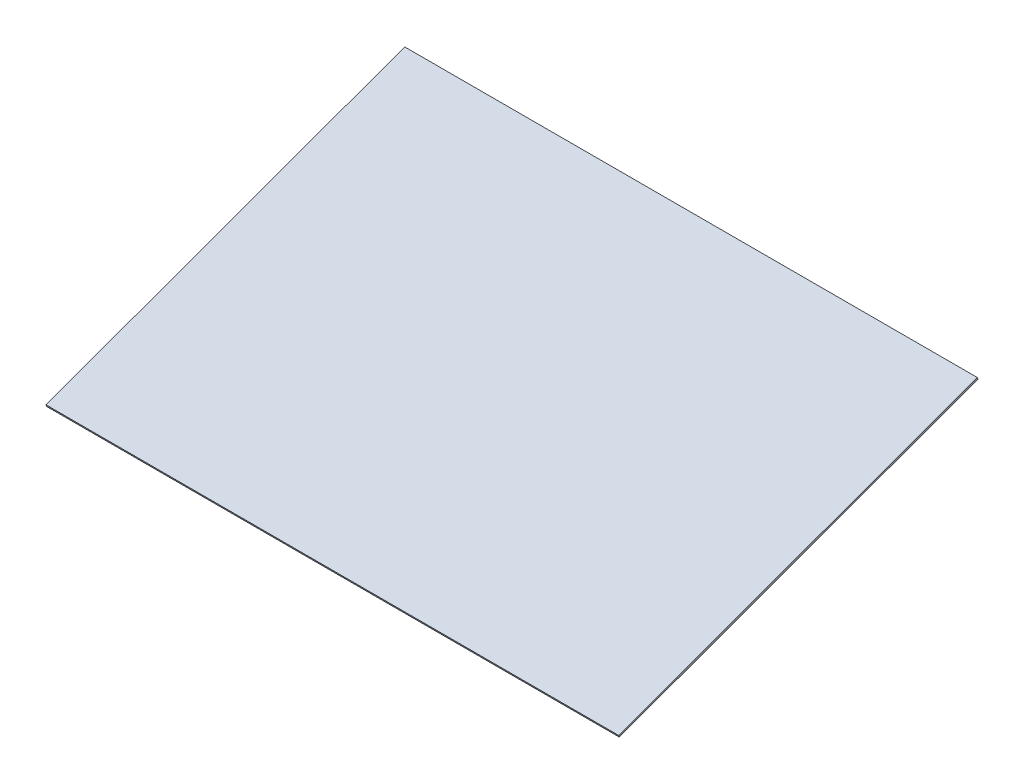
ISO-10303-21;
HEADER;
FILE_DESCRIPTION(('STEP AP214'),'2;1');
FILE_NAME('part.step','',(''),(''),'','','');
FILE_SCHEMA(('AUTOMOTIVE_DESIGN { 1 0 10303 214 1 1 1 1 }'));
ENDSEC;
DATA;
#1=APPLICATION_CONTEXT('core data for automotive mechanical design processes');
#2=APPLICATION_PROTOCOL_DEFINITION('international standard','automotive_design',2000,#1);
#3=PRODUCT_CONTEXT('',#1,'mechanical');
#4=PRODUCT('Part','Part','',(#3));
#5=PRODUCT_RELATED_PRODUCT_CATEGORY('part','',(#4));
#6=PRODUCT_DEFINITION_FORMATION('','',#4);
#7=PRODUCT_DEFINITION_CONTEXT('part definition',#1,'design');
#8=PRODUCT_DEFINITION('design','',#6,#7);
#9=PRODUCT_DEFINITION_SHAPE('','',#8);
#10=(LENGTH_UNIT() NAMED_UNIT(*) SI_UNIT(.MILLI.,.METRE.));
#11=(NAMED_UNIT(*) PLANE_ANGLE_UNIT() SI_UNIT($,.RADIAN.));
#12=(NAMED_UNIT(*) SI_UNIT($,.STERADIAN.) SOLID_ANGLE_UNIT());
#13=UNCERTAINTY_MEASURE_WITH_UNIT(LENGTH_MEASURE(1.E-05),#10,'distance_accuracy_value','');
#14=(GEOMETRIC_REPRESENTATION_CONTEXT(3) GLOBAL_UNCERTAINTY_ASSIGNED_CONTEXT((#13)) GLOBAL_UNIT_ASSIGNED_CONTEXT((#10,
#11,#12)) REPRESENTATION_CONTEXT('',''));
#15=CARTESIAN_POINT('',(0.,0.,0.));
#16=DIRECTION('',(0.,0.,1.));
#17=DIRECTION('',(1.,0.,0.));
#18=AXIS2_PLACEMENT_3D('',#15,#16,#17);
#19=CARTESIAN_POINT('',(0.,-2.05366720093262,57.1757741775686));
#20=DIRECTION('',(-1.,0.,0.));
#21=DIRECTION('',(0.,0.342020143325666,-0.93969262078591));
#22=AXIS2_PLACEMENT_3D('',#19,#20,#21);
#23=PLANE('',#22);
#24=DIRECTION('',(0.,-0.939692620785909,-0.342020143325666));
#25=VECTOR('',#24,1.);
#26=CARTESIAN_POINT('',(0.,-2.05366720093262,57.1757741775686));
#27=LINE('',#26,#25);
#28=CARTESIAN_POINT('',(0.,-1.95969793885403,57.2099761919012));
#29=VERTEX_POINT('',#28);
#30=CARTESIAN_POINT('',(0.,-2.05366720093262,57.1757741775686));
#31=VERTEX_POINT('',#30);
#32=EDGE_CURVE('E11',#29,#31,#27,.T.);
#33=ORIENTED_EDGE('',*,*,#32,.F.);
#34=DIRECTION('',(0.,0.342020143325666,-0.93969262078591));
#35=VECTOR('',#34,1.);
#36=CARTESIAN_POINT('',(0.,-1.95969793885403,57.2099761919012));
#37=LINE('',#36,#35);
#38=CARTESIAN_POINT('',(0.,4.88070492765928,38.416123776183));
#39=VERTEX_POINT('',#38);
#40=EDGE_CURVE('E88',#29,#39,#37,.T.);
#41=ORIENTED_EDGE('',*,*,#40,.T.);
#42=DIRECTION('',(0.,-0.939692620785909,-0.342020143325666));
#43=VECTOR('',#42,1.);
#44=CARTESIAN_POINT('',(0.,4.78673566558069,38.3819217618504));
#45=LINE('',#44,#43);
#46=CARTESIAN_POINT('',(0.,4.78673566558069,38.3819217618504));
#47=VERTEX_POINT('',#46);
#48=EDGE_CURVE('E43',#39,#47,#45,.T.);
#49=ORIENTED_EDGE('',*,*,#48,.T.);
#50=DIRECTION('',(0.,0.342020143325666,-0.93969262078591));
#51=VECTOR('',#50,1.);
#52=CARTESIAN_POINT('',(0.,-2.05366720093262,57.1757741775686));
#53=LINE('',#52,#51);
#54=EDGE_CURVE('E101',#31,#47,#53,.T.);
#55=ORIENTED_EDGE('',*,*,#54,.F.);
#56=EDGE_LOOP('',(#33,#41,#49,#55));
#57=FACE_BOUND('',#56,.T.);
#58=ADVANCED_FACE('F33',(#57),#23,.T.);
#59=CARTESIAN_POINT('',(0.,4.78673566558069,38.3819217618504));
#60=DIRECTION('',(0.,0.342020143325666,-0.93969262078591));
#61=DIRECTION('',(1.,0.,0.));
#62=AXIS2_PLACEMENT_3D('',#59,#60,#61);
#63=PLANE('',#62);
#64=ORIENTED_EDGE('',*,*,#48,.F.);
#65=DIRECTION('',(1.,0.,0.));
#66=VECTOR('',#65,1.);
#67=CARTESIAN_POINT('',(0.,4.88070492765928,38.416123776183));
#68=LINE('',#67,#66);
#69=CARTESIAN_POINT('',(30.,4.88070492765928,38.416123776183));
#70=VERTEX_POINT('',#69);
#71=EDGE_CURVE('E95',#39,#70,#68,.T.);
#72=ORIENTED_EDGE('',*,*,#71,.T.);
#73=DIRECTION('',(0.,-0.939692620785909,-0.342020143325666));
#74=VECTOR('',#73,1.);
#75=CARTESIAN_POINT('',(30.,4.78673566558069,38.3819217618504));
#76=LINE('',#75,#74);
#77=CARTESIAN_POINT('',(30.,4.78673566558069,38.3819217618504));
#78=VERTEX_POINT('',#77);
#79=EDGE_CURVE('E51',#70,#78,#76,.T.);
#80=ORIENTED_EDGE('',*,*,#79,.T.);
#81=DIRECTION('',(1.,0.,0.));
#82=VECTOR('',#81,1.);
#83=CARTESIAN_POINT('',(0.,4.78673566558069,38.3819217618504));
#84=LINE('',#83,#82);
#85=EDGE_CURVE('E82',#47,#78,#84,.T.);
#86=ORIENTED_EDGE('',*,*,#85,.F.);
#87=EDGE_LOOP('',(#64,#72,#80,#86));
#88=FACE_BOUND('',#87,.T.);
#89=ADVANCED_FACE('F105',(#88),#63,.T.);
#90=CARTESIAN_POINT('',(30.,-2.05366720093262,57.1757741775686));
#91=DIRECTION('',(-1.,0.,0.));
#92=DIRECTION('',(0.,0.342020143325666,-0.93969262078591));
#93=AXIS2_PLACEMENT_3D('',#90,#91,#92);
#94=PLANE('',#93);
#95=ORIENTED_EDGE('',*,*,#79,.F.);
#96=DIRECTION('',(0.,0.342020143325666,-0.93969262078591));
#97=VECTOR('',#96,1.);
#98=CARTESIAN_POINT('',(30.,-1.95969793885403,57.2099761919012));
#99=LINE('',#98,#97);
#100=CARTESIAN_POINT('',(30.,-1.95969793885403,57.2099761919012));
#101=VERTEX_POINT('',#100);
#102=EDGE_CURVE('E87',#101,#70,#99,.T.);
#103=ORIENTED_EDGE('',*,*,#102,.F.);
#104=DIRECTION('',(0.,-0.939692620785909,-0.342020143325666));
#105=VECTOR('',#104,1.);
#106=CARTESIAN_POINT('',(30.,-2.05366720093262,57.1757741775686));
#107=LINE('',#106,#105);
#108=CARTESIAN_POINT('',(30.,-2.05366720093262,57.1757741775686));
#109=VERTEX_POINT('',#108);
#110=EDGE_CURVE('E37',#101,#109,#107,.T.);
#111=ORIENTED_EDGE('',*,*,#110,.T.);
#112=DIRECTION('',(0.,0.342020143325666,-0.93969262078591));
#113=VECTOR('',#112,1.);
#114=CARTESIAN_POINT('',(30.,-2.05366720093262,57.1757741775686));
#115=LINE('',#114,#113);
#116=EDGE_CURVE('E97',#109,#78,#115,.T.);
#117=ORIENTED_EDGE('',*,*,#116,.T.);
#118=EDGE_LOOP('',(#95,#103,#111,#117));
#119=FACE_BOUND('',#118,.T.);
#120=ADVANCED_FACE('F90',(#119),#94,.F.);
#121=CARTESIAN_POINT('',(0.,-2.05366720093262,57.1757741775686));
#122=DIRECTION('',(0.,0.342020143325666,-0.93969262078591));
#123=DIRECTION('',(1.,0.,0.));
#124=AXIS2_PLACEMENT_3D('',#121,#122,#123);
#125=PLANE('',#124);
#126=DIRECTION('',(1.,0.,0.));
#127=VECTOR('',#126,1.);
#128=CARTESIAN_POINT('',(0.,-1.95969793885403,57.2099761919012));
#129=LINE('',#128,#127);
#130=EDGE_CURVE('E76',#29,#101,#129,.T.);
#131=ORIENTED_EDGE('',*,*,#130,.F.);
#132=ORIENTED_EDGE('',*,*,#32,.T.);
#133=DIRECTION('',(1.,0.,0.));
#134=VECTOR('',#133,1.);
#135=CARTESIAN_POINT('',(0.,-2.05366720093262,57.1757741775686));
#136=LINE('',#135,#134);
#137=EDGE_CURVE('E78',#31,#109,#136,.T.);
#138=ORIENTED_EDGE('',*,*,#137,.T.);
#139=ORIENTED_EDGE('',*,*,#110,.F.);
#140=EDGE_LOOP('',(#131,#132,#138,#139));
#141=FACE_BOUND('',#140,.T.);
#142=ADVANCED_FACE('F35',(#141),#125,.F.);
#143=CARTESIAN_POINT('',(0.,-2.05366720093262,57.1757741775686));
#144=DIRECTION('',(0.,-0.939692620785909,-0.342020143325666));
#145=DIRECTION('',(0.,0.342020143325666,-0.93969262078591));
#146=AXIS2_PLACEMENT_3D('',#143,#144,#145);
#147=PLANE('',#146);
#148=ORIENTED_EDGE('',*,*,#116,.F.);
#149=ORIENTED_EDGE('',*,*,#137,.F.);
#150=ORIENTED_EDGE('',*,*,#54,.T.);
#151=ORIENTED_EDGE('',*,*,#85,.T.);
#152=EDGE_LOOP('',(#148,#149,#150,#151));
#153=FACE_BOUND('',#152,.T.);
#154=ADVANCED_FACE('F104',(#153),#147,.T.);
#155=CARTESIAN_POINT('',(0.,-1.95969793885403,57.2099761919012));
#156=DIRECTION('',(0.,-0.939692620785909,-0.342020143325666));
#157=DIRECTION('',(0.,0.342020143325666,-0.93969262078591));
#158=AXIS2_PLACEMENT_3D('',#155,#156,#157);
#159=PLANE('',#158);
#160=ORIENTED_EDGE('',*,*,#102,.T.);
#161=ORIENTED_EDGE('',*,*,#71,.F.);
#162=ORIENTED_EDGE('',*,*,#40,.F.);
#163=ORIENTED_EDGE('',*,*,#130,.T.);
#164=EDGE_LOOP('',(#160,#161,#162,#163));
#165=FACE_BOUND('',#164,.T.);
#166=ADVANCED_FACE('F85',(#165),#159,.F.);
#167=CLOSED_SHELL('',(#58,#89,#120,#142,#154,#166));
#168=MANIFOLD_SOLID_BREP('B2',#167);
#169=ADVANCED_BREP_SHAPE_REPRESENTATION('',(#18,#168),#14);
#170=SHAPE_DEFINITION_REPRESENTATION(#9,#169);
ENDSEC;
END-ISO-10303-21;
